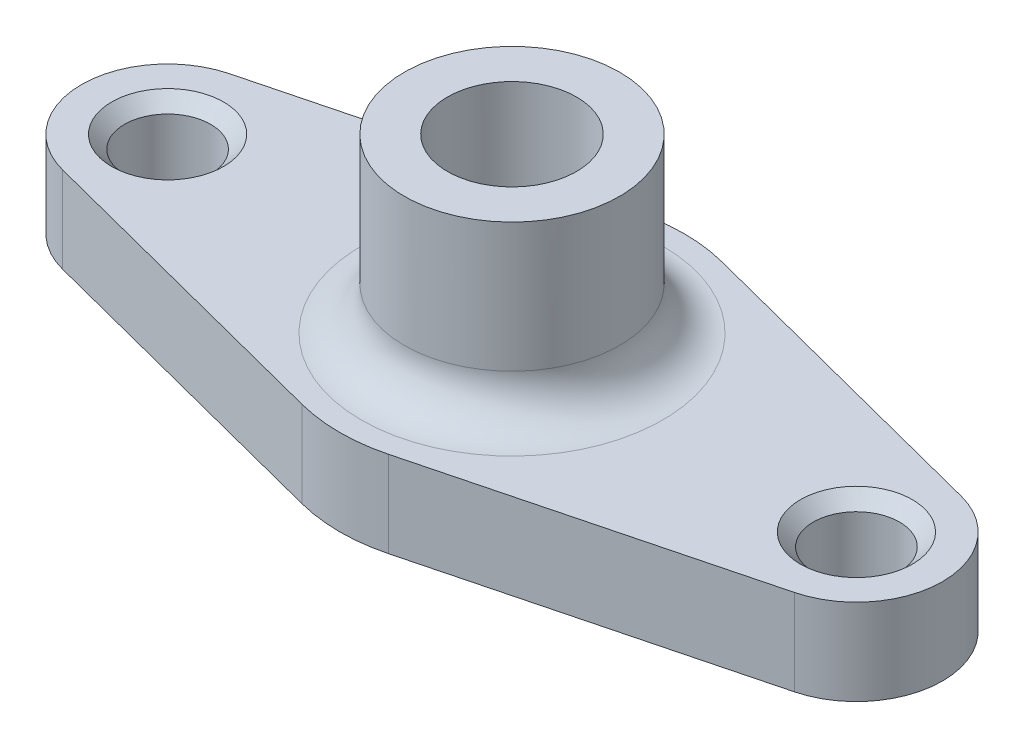
ISO-10303-21;
HEADER;
FILE_DESCRIPTION(('STEP AP214'),'2;1');
FILE_NAME('part.step','',(''),(''),'','','');
FILE_SCHEMA(('AUTOMOTIVE_DESIGN { 1 0 10303 214 1 1 1 1 }'));
ENDSEC;
DATA;
#1=APPLICATION_CONTEXT('core data for automotive mechanical design processes');
#2=APPLICATION_PROTOCOL_DEFINITION('international standard','automotive_design',2000,#1);
#3=PRODUCT_CONTEXT('',#1,'mechanical');
#4=PRODUCT('Part','Part','',(#3));
#5=PRODUCT_RELATED_PRODUCT_CATEGORY('part','',(#4));
#6=PRODUCT_DEFINITION_FORMATION('','',#4);
#7=PRODUCT_DEFINITION_CONTEXT('part definition',#1,'design');
#8=PRODUCT_DEFINITION('design','',#6,#7);
#9=PRODUCT_DEFINITION_SHAPE('','',#8);
#10=(LENGTH_UNIT() NAMED_UNIT(*) SI_UNIT(.MILLI.,.METRE.));
#11=(NAMED_UNIT(*) PLANE_ANGLE_UNIT() SI_UNIT($,.RADIAN.));
#12=(NAMED_UNIT(*) SI_UNIT($,.STERADIAN.) SOLID_ANGLE_UNIT());
#13=UNCERTAINTY_MEASURE_WITH_UNIT(LENGTH_MEASURE(1.E-05),#10,'distance_accuracy_value','');
#14=(GEOMETRIC_REPRESENTATION_CONTEXT(3) GLOBAL_UNCERTAINTY_ASSIGNED_CONTEXT((#13)) GLOBAL_UNIT_ASSIGNED_CONTEXT((#10,
#11,#12)) REPRESENTATION_CONTEXT('',''));
#15=CARTESIAN_POINT('',(0.,0.,0.));
#16=DIRECTION('',(0.,0.,1.));
#17=DIRECTION('',(1.,0.,0.));
#18=AXIS2_PLACEMENT_3D('',#15,#16,#17);
#19=CARTESIAN_POINT('',(-80.,20.,0.));
#20=DIRECTION('',(0.,-1.,0.));
#21=DIRECTION('',(0.,0.,-1.));
#22=AXIS2_PLACEMENT_3D('',#19,#20,#21);
#23=CYLINDRICAL_SURFACE('',#22,20.);
#24=CARTESIAN_POINT('',(-80.,0.,0.));
#25=DIRECTION('',(0.,1.,0.));
#26=DIRECTION('',(0.,0.,1.));
#27=AXIS2_PLACEMENT_3D('',#24,#25,#26);
#28=CIRCLE('',#27,20.);
#29=CARTESIAN_POINT('',(-85.,0.,19.3649167310371));
#30=VERTEX_POINT('',#29);
#31=CARTESIAN_POINT('',(-85.,0.,-19.3649167310371));
#32=VERTEX_POINT('',#31);
#33=EDGE_CURVE('E149',#30,#32,#28,.F.);
#34=ORIENTED_EDGE('',*,*,#33,.F.);
#35=DIRECTION('',(0.,-1.,0.));
#36=VECTOR('',#35,1.);
#37=CARTESIAN_POINT('',(-85.,20.,19.3649167310371));
#38=LINE('',#37,#36);
#39=CARTESIAN_POINT('',(-85.,20.,19.3649167310371));
#40=VERTEX_POINT('',#39);
#41=EDGE_CURVE('E104',#40,#30,#38,.T.);
#42=ORIENTED_EDGE('',*,*,#41,.F.);
#43=CARTESIAN_POINT('',(-80.,20.,0.));
#44=DIRECTION('',(0.,1.,0.));
#45=DIRECTION('',(0.,0.,1.));
#46=AXIS2_PLACEMENT_3D('',#43,#44,#45);
#47=CIRCLE('',#46,20.);
#48=CARTESIAN_POINT('',(-85.,20.,-19.3649167310371));
#49=VERTEX_POINT('',#48);
#50=EDGE_CURVE('E185',#40,#49,#47,.F.);
#51=ORIENTED_EDGE('',*,*,#50,.T.);
#52=DIRECTION('',(0.,-1.,0.));
#53=VECTOR('',#52,1.);
#54=CARTESIAN_POINT('',(-85.,20.,-19.3649167310371));
#55=LINE('',#54,#53);
#56=EDGE_CURVE('E99',#49,#32,#55,.T.);
#57=ORIENTED_EDGE('',*,*,#56,.T.);
#58=EDGE_LOOP('',(#34,#42,#51,#57));
#59=FACE_BOUND('',#58,.T.);
#60=ADVANCED_FACE('F45',(#59),#23,.T.);
#61=CARTESIAN_POINT('',(-10.,20.,38.7298334620742));
#62=DIRECTION('',(-0.25,0.,0.968245836551854));
#63=DIRECTION('',(0.968245836551854,0.,0.25));
#64=AXIS2_PLACEMENT_3D('',#61,#62,#63);
#65=PLANE('',#64);
#66=DIRECTION('',(-0.968245836551854,0.,-0.25));
#67=VECTOR('',#66,1.);
#68=CARTESIAN_POINT('',(-10.,0.,38.7298334620742));
#69=LINE('',#68,#67);
#70=CARTESIAN_POINT('',(-10.,0.,38.7298334620742));
#71=VERTEX_POINT('',#70);
#72=EDGE_CURVE('E153',#71,#30,#69,.T.);
#73=ORIENTED_EDGE('',*,*,#72,.F.);
#74=DIRECTION('',(0.,-1.,0.));
#75=VECTOR('',#74,1.);
#76=CARTESIAN_POINT('',(-10.,20.,38.7298334620742));
#77=LINE('',#76,#75);
#78=CARTESIAN_POINT('',(-10.,20.,38.7298334620742));
#79=VERTEX_POINT('',#78);
#80=EDGE_CURVE('E200',#79,#71,#77,.T.);
#81=ORIENTED_EDGE('',*,*,#80,.F.);
#82=DIRECTION('',(-0.968245836551854,0.,-0.25));
#83=VECTOR('',#82,1.);
#84=CARTESIAN_POINT('',(-10.,20.,38.7298334620742));
#85=LINE('',#84,#83);
#86=EDGE_CURVE('E294',#79,#40,#85,.T.);
#87=ORIENTED_EDGE('',*,*,#86,.T.);
#88=ORIENTED_EDGE('',*,*,#41,.T.);
#89=EDGE_LOOP('',(#73,#81,#87,#88));
#90=FACE_BOUND('',#89,.T.);
#91=ADVANCED_FACE('F236',(#90),#65,.T.);
#92=CARTESIAN_POINT('',(0.,20.,0.));
#93=DIRECTION('',(0.,-1.,0.));
#94=DIRECTION('',(0.,0.,-1.));
#95=AXIS2_PLACEMENT_3D('',#92,#93,#94);
#96=CYLINDRICAL_SURFACE('',#95,40.);
#97=CARTESIAN_POINT('',(0.,0.,0.));
#98=DIRECTION('',(0.,1.,0.));
#99=DIRECTION('',(0.,0.,1.));
#100=AXIS2_PLACEMENT_3D('',#97,#98,#99);
#101=CIRCLE('',#100,40.);
#102=CARTESIAN_POINT('',(10.,0.,38.7298334620742));
#103=VERTEX_POINT('',#102);
#104=EDGE_CURVE('E158',#71,#103,#101,.T.);
#105=ORIENTED_EDGE('',*,*,#104,.T.);
#106=DIRECTION('',(0.,-1.,0.));
#107=VECTOR('',#106,1.);
#108=CARTESIAN_POINT('',(10.,20.,38.7298334620742));
#109=LINE('',#108,#107);
#110=CARTESIAN_POINT('',(10.,20.,38.7298334620742));
#111=VERTEX_POINT('',#110);
#112=EDGE_CURVE('E196',#111,#103,#109,.T.);
#113=ORIENTED_EDGE('',*,*,#112,.F.);
#114=CARTESIAN_POINT('',(0.,20.,0.));
#115=DIRECTION('',(0.,1.,0.));
#116=DIRECTION('',(0.,0.,1.));
#117=AXIS2_PLACEMENT_3D('',#114,#115,#116);
#118=CIRCLE('',#117,40.);
#119=EDGE_CURVE('E135',#79,#111,#118,.T.);
#120=ORIENTED_EDGE('',*,*,#119,.F.);
#121=ORIENTED_EDGE('',*,*,#80,.T.);
#122=EDGE_LOOP('',(#105,#113,#120,#121));
#123=FACE_BOUND('',#122,.T.);
#124=ADVANCED_FACE('F241',(#123),#96,.T.);
#125=CARTESIAN_POINT('',(10.,20.,38.7298334620742));
#126=DIRECTION('',(-0.25,0.,-0.968245836551854));
#127=DIRECTION('',(-0.968245836551854,0.,0.25));
#128=AXIS2_PLACEMENT_3D('',#125,#126,#127);
#129=PLANE('',#128);
#130=DIRECTION('',(0.968245836551854,0.,-0.25));
#131=VECTOR('',#130,1.);
#132=CARTESIAN_POINT('',(10.,0.,38.7298334620742));
#133=LINE('',#132,#131);
#134=CARTESIAN_POINT('',(85.,0.,19.3649167310371));
#135=VERTEX_POINT('',#134);
#136=EDGE_CURVE('E161',#103,#135,#133,.T.);
#137=ORIENTED_EDGE('',*,*,#136,.T.);
#138=DIRECTION('',(0.,-1.,0.));
#139=VECTOR('',#138,1.);
#140=CARTESIAN_POINT('',(85.,20.,19.3649167310371));
#141=LINE('',#140,#139);
#142=CARTESIAN_POINT('',(85.,20.,19.3649167310371));
#143=VERTEX_POINT('',#142);
#144=EDGE_CURVE('E192',#143,#135,#141,.T.);
#145=ORIENTED_EDGE('',*,*,#144,.F.);
#146=DIRECTION('',(0.968245836551854,0.,-0.25));
#147=VECTOR('',#146,1.);
#148=CARTESIAN_POINT('',(10.,20.,38.7298334620742));
#149=LINE('',#148,#147);
#150=EDGE_CURVE('E143',#111,#143,#149,.T.);
#151=ORIENTED_EDGE('',*,*,#150,.F.);
#152=ORIENTED_EDGE('',*,*,#112,.T.);
#153=EDGE_LOOP('',(#137,#145,#151,#152));
#154=FACE_BOUND('',#153,.T.);
#155=ADVANCED_FACE('F305',(#154),#129,.F.);
#156=CARTESIAN_POINT('',(80.,20.,0.));
#157=DIRECTION('',(0.,-1.,0.));
#158=DIRECTION('',(0.,0.,-1.));
#159=AXIS2_PLACEMENT_3D('',#156,#157,#158);
#160=CYLINDRICAL_SURFACE('',#159,20.);
#161=CARTESIAN_POINT('',(80.,0.,0.));
#162=DIRECTION('',(0.,1.,0.));
#163=DIRECTION('',(0.,0.,1.));
#164=AXIS2_PLACEMENT_3D('',#161,#162,#163);
#165=CIRCLE('',#164,20.);
#166=CARTESIAN_POINT('',(85.,0.,-19.3649167310371));
#167=VERTEX_POINT('',#166);
#168=EDGE_CURVE('E164',#135,#167,#165,.T.);
#169=ORIENTED_EDGE('',*,*,#168,.T.);
#170=DIRECTION('',(0.,-1.,0.));
#171=VECTOR('',#170,1.);
#172=CARTESIAN_POINT('',(85.,20.,-19.3649167310371));
#173=LINE('',#172,#171);
#174=CARTESIAN_POINT('',(85.,20.,-19.3649167310371));
#175=VERTEX_POINT('',#174);
#176=EDGE_CURVE('E128',#175,#167,#173,.T.);
#177=ORIENTED_EDGE('',*,*,#176,.F.);
#178=CARTESIAN_POINT('',(80.,20.,0.));
#179=DIRECTION('',(0.,1.,0.));
#180=DIRECTION('',(0.,0.,1.));
#181=AXIS2_PLACEMENT_3D('',#178,#179,#180);
#182=CIRCLE('',#181,20.);
#183=EDGE_CURVE('E138',#143,#175,#182,.T.);
#184=ORIENTED_EDGE('',*,*,#183,.F.);
#185=ORIENTED_EDGE('',*,*,#144,.T.);
#186=EDGE_LOOP('',(#169,#177,#184,#185));
#187=FACE_BOUND('',#186,.T.);
#188=ADVANCED_FACE('F309',(#187),#160,.T.);
#189=CARTESIAN_POINT('',(10.,20.,-38.7298334620742));
#190=DIRECTION('',(0.25,0.,-0.968245836551854));
#191=DIRECTION('',(-0.968245836551854,0.,-0.25));
#192=AXIS2_PLACEMENT_3D('',#189,#190,#191);
#193=PLANE('',#192);
#194=DIRECTION('',(0.968245836551854,0.,0.25));
#195=VECTOR('',#194,1.);
#196=CARTESIAN_POINT('',(10.,0.,-38.7298334620742));
#197=LINE('',#196,#195);
#198=CARTESIAN_POINT('',(10.,0.,-38.7298334620742));
#199=VERTEX_POINT('',#198);
#200=EDGE_CURVE('E126',#199,#167,#197,.T.);
#201=ORIENTED_EDGE('',*,*,#200,.F.);
#202=DIRECTION('',(0.,-1.,0.));
#203=VECTOR('',#202,1.);
#204=CARTESIAN_POINT('',(10.,20.,-38.7298334620742));
#205=LINE('',#204,#203);
#206=CARTESIAN_POINT('',(10.,20.,-38.7298334620742));
#207=VERTEX_POINT('',#206);
#208=EDGE_CURVE('E120',#207,#199,#205,.T.);
#209=ORIENTED_EDGE('',*,*,#208,.F.);
#210=DIRECTION('',(0.968245836551854,0.,0.25));
#211=VECTOR('',#210,1.);
#212=CARTESIAN_POINT('',(10.,20.,-38.7298334620742));
#213=LINE('',#212,#211);
#214=EDGE_CURVE('E124',#207,#175,#213,.T.);
#215=ORIENTED_EDGE('',*,*,#214,.T.);
#216=ORIENTED_EDGE('',*,*,#176,.T.);
#217=EDGE_LOOP('',(#201,#209,#215,#216));
#218=FACE_BOUND('',#217,.T.);
#219=ADVANCED_FACE('F122',(#218),#193,.T.);
#220=CARTESIAN_POINT('',(-10.,0.,-38.7298334620742));
#221=VERTEX_POINT('',#220);
#222=EDGE_CURVE('E92',#199,#221,#101,.T.);
#223=ORIENTED_EDGE('',*,*,#222,.T.);
#224=DIRECTION('',(0.,-1.,0.));
#225=VECTOR('',#224,1.);
#226=CARTESIAN_POINT('',(-10.,20.,-38.7298334620742));
#227=LINE('',#226,#225);
#228=CARTESIAN_POINT('',(-10.,20.,-38.7298334620742));
#229=VERTEX_POINT('',#228);
#230=EDGE_CURVE('E129',#229,#221,#227,.T.);
#231=ORIENTED_EDGE('',*,*,#230,.F.);
#232=EDGE_CURVE('E131',#207,#229,#118,.T.);
#233=ORIENTED_EDGE('',*,*,#232,.F.);
#234=ORIENTED_EDGE('',*,*,#208,.T.);
#235=EDGE_LOOP('',(#223,#231,#233,#234));
#236=FACE_BOUND('',#235,.T.);
#237=ADVANCED_FACE('F132',(#236),#96,.T.);
#238=CARTESIAN_POINT('',(80.,20.,0.));
#239=DIRECTION('',(0.,-1.,0.));
#240=DIRECTION('',(0.,0.,-1.));
#241=AXIS2_PLACEMENT_3D('',#238,#239,#240);
#242=CYLINDRICAL_SURFACE('',#241,9.99999999999999);
#243=CARTESIAN_POINT('',(80.,17.,0.));
#244=DIRECTION('',(0.,1.,0.));
#245=DIRECTION('',(0.,0.,1.));
#246=AXIS2_PLACEMENT_3D('',#243,#244,#245);
#247=CIRCLE('',#246,9.99999999999999);
#248=CARTESIAN_POINT('',(80.,17.,9.99999999999999));
#249=VERTEX_POINT('',#248);
#250=EDGE_CURVE('E11',#249,#249,#247,.T.);
#251=ORIENTED_EDGE('',*,*,#250,.T.);
#252=EDGE_LOOP('',(#251));
#253=FACE_BOUND('',#252,.T.);
#254=CARTESIAN_POINT('',(80.,0.,0.));
#255=DIRECTION('',(0.,1.,0.));
#256=DIRECTION('',(0.,0.,1.));
#257=AXIS2_PLACEMENT_3D('',#254,#255,#256);
#258=CIRCLE('',#257,9.99999999999999);
#259=CARTESIAN_POINT('',(80.,0.,9.99999999999999));
#260=VERTEX_POINT('',#259);
#261=EDGE_CURVE('E177',#260,#260,#258,.F.);
#262=ORIENTED_EDGE('',*,*,#261,.T.);
#263=EDGE_LOOP('',(#262));
#264=FACE_BOUND('',#263,.T.);
#265=ADVANCED_FACE('F266',(#253,#264),#242,.F.);
#266=CARTESIAN_POINT('',(-80.,20.,0.));
#267=DIRECTION('',(0.,-1.,0.));
#268=DIRECTION('',(0.,0.,-1.));
#269=AXIS2_PLACEMENT_3D('',#266,#267,#268);
#270=CYLINDRICAL_SURFACE('',#269,9.99999999999999);
#271=CARTESIAN_POINT('',(-80.,17.,0.));
#272=DIRECTION('',(0.,1.,0.));
#273=DIRECTION('',(0.,0.,1.));
#274=AXIS2_PLACEMENT_3D('',#271,#272,#273);
#275=CIRCLE('',#274,9.99999999999999);
#276=CARTESIAN_POINT('',(-80.,17.,9.99999999999999));
#277=VERTEX_POINT('',#276);
#278=EDGE_CURVE('E205',#277,#277,#275,.T.);
#279=ORIENTED_EDGE('',*,*,#278,.T.);
#280=EDGE_LOOP('',(#279));
#281=FACE_BOUND('',#280,.T.);
#282=CARTESIAN_POINT('',(-80.,0.,0.));
#283=DIRECTION('',(0.,1.,0.));
#284=DIRECTION('',(0.,0.,1.));
#285=AXIS2_PLACEMENT_3D('',#282,#283,#284);
#286=CIRCLE('',#285,9.99999999999999);
#287=CARTESIAN_POINT('',(-80.,0.,9.99999999999999));
#288=VERTEX_POINT('',#287);
#289=EDGE_CURVE('E173',#288,#288,#286,.T.);
#290=ORIENTED_EDGE('',*,*,#289,.F.);
#291=EDGE_LOOP('',(#290));
#292=FACE_BOUND('',#291,.T.);
#293=ADVANCED_FACE('F262',(#281,#292),#270,.F.);
#294=CARTESIAN_POINT('',(-10.,20.,-38.7298334620742));
#295=DIRECTION('',(0.25,0.,0.968245836551854));
#296=DIRECTION('',(0.968245836551854,0.,-0.25));
#297=AXIS2_PLACEMENT_3D('',#294,#295,#296);
#298=PLANE('',#297);
#299=DIRECTION('',(-0.968245836551854,0.,0.25));
#300=VECTOR('',#299,1.);
#301=CARTESIAN_POINT('',(-10.,0.,-38.7298334620742));
#302=LINE('',#301,#300);
#303=EDGE_CURVE('E170',#221,#32,#302,.T.);
#304=ORIENTED_EDGE('',*,*,#303,.T.);
#305=ORIENTED_EDGE('',*,*,#56,.F.);
#306=DIRECTION('',(-0.968245836551854,0.,0.25));
#307=VECTOR('',#306,1.);
#308=CARTESIAN_POINT('',(-10.,20.,-38.7298334620742));
#309=LINE('',#308,#307);
#310=EDGE_CURVE('E64',#229,#49,#309,.T.);
#311=ORIENTED_EDGE('',*,*,#310,.F.);
#312=ORIENTED_EDGE('',*,*,#230,.T.);
#313=EDGE_LOOP('',(#304,#305,#311,#312));
#314=FACE_BOUND('',#313,.T.);
#315=ADVANCED_FACE('F265',(#314),#298,.F.);
#316=CARTESIAN_POINT('',(0.,20.,0.));
#317=DIRECTION('',(0.,-1.,0.));
#318=DIRECTION('',(0.,0.,-1.));
#319=AXIS2_PLACEMENT_3D('',#316,#317,#318);
#320=CYLINDRICAL_SURFACE('',#319,15.);
#321=CARTESIAN_POINT('',(0.,0.,0.));
#322=DIRECTION('',(0.,1.,0.));
#323=DIRECTION('',(0.,0.,1.));
#324=AXIS2_PLACEMENT_3D('',#321,#322,#323);
#325=CIRCLE('',#324,15.);
#326=CARTESIAN_POINT('',(0.,0.,15.));
#327=VERTEX_POINT('',#326);
#328=EDGE_CURVE('E181',#327,#327,#325,.T.);
#329=ORIENTED_EDGE('',*,*,#328,.F.);
#330=EDGE_LOOP('',(#329));
#331=FACE_BOUND('',#330,.T.);
#332=CARTESIAN_POINT('',(0.,60.,0.));
#333=DIRECTION('',(0.,-1.,0.));
#334=DIRECTION('',(0.,0.,-1.));
#335=AXIS2_PLACEMENT_3D('',#332,#333,#334);
#336=CIRCLE('',#335,15.);
#337=CARTESIAN_POINT('',(0.,60.,-15.));
#338=VERTEX_POINT('',#337);
#339=EDGE_CURVE('E285',#338,#338,#336,.T.);
#340=ORIENTED_EDGE('',*,*,#339,.F.);
#341=EDGE_LOOP('',(#340));
#342=FACE_BOUND('',#341,.T.);
#343=ADVANCED_FACE('F279',(#331,#342),#320,.F.);
#344=CARTESIAN_POINT('',(0.,20.,0.));
#345=DIRECTION('',(0.,1.,0.));
#346=DIRECTION('',(0.,0.,1.));
#347=AXIS2_PLACEMENT_3D('',#344,#345,#346);
#348=PLANE('',#347);
#349=CARTESIAN_POINT('',(80.,20.,0.));
#350=DIRECTION('',(0.,1.,0.));
#351=DIRECTION('',(0.,0.,1.));
#352=AXIS2_PLACEMENT_3D('',#349,#350,#351);
#353=CIRCLE('',#352,13.);
#354=CARTESIAN_POINT('',(80.,20.,13.));
#355=VERTEX_POINT('',#354);
#356=EDGE_CURVE('E56',#355,#355,#353,.F.);
#357=ORIENTED_EDGE('',*,*,#356,.T.);
#358=EDGE_LOOP('',(#357));
#359=FACE_BOUND('',#358,.T.);
#360=CARTESIAN_POINT('',(0.,20.,0.));
#361=DIRECTION('',(0.,1.,0.));
#362=DIRECTION('',(0.,0.,1.));
#363=AXIS2_PLACEMENT_3D('',#360,#361,#362);
#364=CIRCLE('',#363,35.);
#365=CARTESIAN_POINT('',(0.,20.,35.));
#366=VERTEX_POINT('',#365);
#367=EDGE_CURVE('E217',#366,#366,#364,.F.);
#368=ORIENTED_EDGE('',*,*,#367,.T.);
#369=EDGE_LOOP('',(#368));
#370=FACE_BOUND('',#369,.T.);
#371=CARTESIAN_POINT('',(-80.,20.,0.));
#372=DIRECTION('',(0.,1.,0.));
#373=DIRECTION('',(0.,0.,1.));
#374=AXIS2_PLACEMENT_3D('',#371,#372,#373);
#375=CIRCLE('',#374,13.);
#376=CARTESIAN_POINT('',(-80.,20.,13.));
#377=VERTEX_POINT('',#376);
#378=EDGE_CURVE('E209',#377,#377,#375,.F.);
#379=ORIENTED_EDGE('',*,*,#378,.T.);
#380=EDGE_LOOP('',(#379));
#381=FACE_BOUND('',#380,.T.);
#382=ORIENTED_EDGE('',*,*,#50,.F.);
#383=ORIENTED_EDGE('',*,*,#86,.F.);
#384=ORIENTED_EDGE('',*,*,#119,.T.);
#385=ORIENTED_EDGE('',*,*,#150,.T.);
#386=ORIENTED_EDGE('',*,*,#183,.T.);
#387=ORIENTED_EDGE('',*,*,#214,.F.);
#388=ORIENTED_EDGE('',*,*,#232,.T.);
#389=ORIENTED_EDGE('',*,*,#310,.T.);
#390=EDGE_LOOP('',(#382,#383,#384,#385,#386,#387,#388,#389));
#391=FACE_BOUND('',#390,.T.);
#392=ADVANCED_FACE('F136',(#359,#370,#381,#391),#348,.T.);
#393=CARTESIAN_POINT('',(0.,0.,0.));
#394=DIRECTION('',(0.,1.,0.));
#395=DIRECTION('',(0.,0.,1.));
#396=AXIS2_PLACEMENT_3D('',#393,#394,#395);
#397=PLANE('',#396);
#398=ORIENTED_EDGE('',*,*,#33,.T.);
#399=ORIENTED_EDGE('',*,*,#303,.F.);
#400=ORIENTED_EDGE('',*,*,#222,.F.);
#401=ORIENTED_EDGE('',*,*,#200,.T.);
#402=ORIENTED_EDGE('',*,*,#168,.F.);
#403=ORIENTED_EDGE('',*,*,#136,.F.);
#404=ORIENTED_EDGE('',*,*,#104,.F.);
#405=ORIENTED_EDGE('',*,*,#72,.T.);
#406=EDGE_LOOP('',(#398,#399,#400,#401,#402,#403,#404,#405));
#407=FACE_BOUND('',#406,.T.);
#408=ORIENTED_EDGE('',*,*,#289,.T.);
#409=EDGE_LOOP('',(#408));
#410=FACE_BOUND('',#409,.T.);
#411=ORIENTED_EDGE('',*,*,#261,.F.);
#412=EDGE_LOOP('',(#411));
#413=FACE_BOUND('',#412,.T.);
#414=ORIENTED_EDGE('',*,*,#328,.T.);
#415=EDGE_LOOP('',(#414));
#416=FACE_BOUND('',#415,.T.);
#417=ADVANCED_FACE('F270',(#407,#410,#413,#416),#397,.F.);
#418=CARTESIAN_POINT('',(0.,60.,0.));
#419=DIRECTION('',(0.,-1.,0.));
#420=DIRECTION('',(0.,0.,-1.));
#421=AXIS2_PLACEMENT_3D('',#418,#419,#420);
#422=CYLINDRICAL_SURFACE('',#421,25.);
#423=CARTESIAN_POINT('',(0.,30.,0.));
#424=DIRECTION('',(0.,1.,0.));
#425=DIRECTION('',(0.,0.,1.));
#426=AXIS2_PLACEMENT_3D('',#423,#424,#425);
#427=CIRCLE('',#426,25.);
#428=CARTESIAN_POINT('',(0.,30.,25.));
#429=VERTEX_POINT('',#428);
#430=EDGE_CURVE('E213',#429,#429,#427,.T.);
#431=ORIENTED_EDGE('',*,*,#430,.T.);
#432=EDGE_LOOP('',(#431));
#433=FACE_BOUND('',#432,.T.);
#434=CARTESIAN_POINT('',(0.,60.,0.));
#435=DIRECTION('',(0.,-1.,0.));
#436=DIRECTION('',(0.,0.,-1.));
#437=AXIS2_PLACEMENT_3D('',#434,#435,#436);
#438=CIRCLE('',#437,25.);
#439=CARTESIAN_POINT('',(0.,60.,-25.));
#440=VERTEX_POINT('',#439);
#441=EDGE_CURVE('E154',#440,#440,#438,.T.);
#442=ORIENTED_EDGE('',*,*,#441,.T.);
#443=EDGE_LOOP('',(#442));
#444=FACE_BOUND('',#443,.T.);
#445=ADVANCED_FACE('F255',(#433,#444),#422,.T.);
#446=CARTESIAN_POINT('',(0.,60.,0.));
#447=DIRECTION('',(0.,-1.,0.));
#448=DIRECTION('',(0.,0.,-1.));
#449=AXIS2_PLACEMENT_3D('',#446,#447,#448);
#450=PLANE('',#449);
#451=ORIENTED_EDGE('',*,*,#339,.T.);
#452=EDGE_LOOP('',(#451));
#453=FACE_BOUND('',#452,.T.);
#454=ORIENTED_EDGE('',*,*,#441,.F.);
#455=EDGE_LOOP('',(#454));
#456=FACE_BOUND('',#455,.T.);
#457=ADVANCED_FACE('F250',(#453,#456),#450,.F.);
#458=CARTESIAN_POINT('',(-80.,17.,0.));
#459=DIRECTION('',(0.,1.,0.));
#460=DIRECTION('',(0.,0.,1.));
#461=AXIS2_PLACEMENT_3D('',#458,#459,#460);
#462=CONICAL_SURFACE('',#461,9.99999999999999,0.785398163397447);
#463=CARTESIAN_POINT('',(-80.,20.,13.));
#464=CARTESIAN_POINT('',(-80.,19.96875,12.96875));
#465=CARTESIAN_POINT('',(-80.,19.9375,12.9375));
#466=CARTESIAN_POINT('',(-80.,19.875,12.875));
#467=CARTESIAN_POINT('',(-80.,19.84375,12.84375));
#468=CARTESIAN_POINT('',(-80.,19.78125,12.78125));
#469=CARTESIAN_POINT('',(-80.,19.75,12.75));
#470=CARTESIAN_POINT('',(-80.,19.6875,12.6875));
#471=CARTESIAN_POINT('',(-80.,19.65625,12.65625));
#472=CARTESIAN_POINT('',(-80.,19.59375,12.59375));
#473=CARTESIAN_POINT('',(-80.,19.5625,12.5625));
#474=CARTESIAN_POINT('',(-80.,19.5,12.5));
#475=CARTESIAN_POINT('',(-80.,19.46875,12.46875));
#476=CARTESIAN_POINT('',(-80.,19.40625,12.40625));
#477=CARTESIAN_POINT('',(-80.,19.375,12.375));
#478=CARTESIAN_POINT('',(-80.,19.3125,12.3125));
#479=CARTESIAN_POINT('',(-80.,19.28125,12.28125));
#480=CARTESIAN_POINT('',(-80.,19.21875,12.21875));
#481=CARTESIAN_POINT('',(-80.,19.1875,12.1875));
#482=CARTESIAN_POINT('',(-80.,19.125,12.125));
#483=CARTESIAN_POINT('',(-80.,19.09375,12.09375));
#484=CARTESIAN_POINT('',(-80.,19.03125,12.03125));
#485=CARTESIAN_POINT('',(-80.,19.,12.));
#486=CARTESIAN_POINT('',(-80.,18.9375,11.9375));
#487=CARTESIAN_POINT('',(-80.,18.90625,11.90625));
#488=CARTESIAN_POINT('',(-80.,18.84375,11.84375));
#489=CARTESIAN_POINT('',(-80.,18.8125,11.8125));
#490=CARTESIAN_POINT('',(-80.,18.75,11.75));
#491=CARTESIAN_POINT('',(-80.,18.71875,11.71875));
#492=CARTESIAN_POINT('',(-80.,18.65625,11.65625));
#493=CARTESIAN_POINT('',(-80.,18.625,11.625));
#494=CARTESIAN_POINT('',(-80.,18.5625,11.5625));
#495=CARTESIAN_POINT('',(-80.,18.53125,11.53125));
#496=CARTESIAN_POINT('',(-80.,18.46875,11.46875));
#497=CARTESIAN_POINT('',(-80.,18.4375,11.4375));
#498=CARTESIAN_POINT('',(-80.,18.375,11.375));
#499=CARTESIAN_POINT('',(-80.,18.34375,11.34375));
#500=CARTESIAN_POINT('',(-80.,18.28125,11.28125));
#501=CARTESIAN_POINT('',(-80.,18.25,11.25));
#502=CARTESIAN_POINT('',(-80.,18.1875,11.1875));
#503=CARTESIAN_POINT('',(-80.,18.15625,11.15625));
#504=CARTESIAN_POINT('',(-80.,18.09375,11.09375));
#505=CARTESIAN_POINT('',(-80.,18.0625,11.0625));
#506=CARTESIAN_POINT('',(-80.,18.,11.));
#507=CARTESIAN_POINT('',(-80.,17.96875,10.96875));
#508=CARTESIAN_POINT('',(-80.,17.90625,10.90625));
#509=CARTESIAN_POINT('',(-80.,17.875,10.875));
#510=CARTESIAN_POINT('',(-80.,17.8125,10.8125));
#511=CARTESIAN_POINT('',(-80.,17.78125,10.78125));
#512=CARTESIAN_POINT('',(-80.,17.71875,10.71875));
#513=CARTESIAN_POINT('',(-80.,17.6875,10.6875));
#514=CARTESIAN_POINT('',(-80.,17.625,10.625));
#515=CARTESIAN_POINT('',(-80.,17.59375,10.59375));
#516=CARTESIAN_POINT('',(-80.,17.53125,10.53125));
#517=CARTESIAN_POINT('',(-80.,17.5,10.5));
#518=CARTESIAN_POINT('',(-80.,17.4375,10.4375));
#519=CARTESIAN_POINT('',(-80.,17.40625,10.40625));
#520=CARTESIAN_POINT('',(-80.,17.34375,10.34375));
#521=CARTESIAN_POINT('',(-80.,17.3125,10.3125));
#522=CARTESIAN_POINT('',(-80.,17.25,10.25));
#523=CARTESIAN_POINT('',(-80.,17.21875,10.21875));
#524=CARTESIAN_POINT('',(-80.,17.15625,10.15625));
#525=CARTESIAN_POINT('',(-80.,17.125,10.125));
#526=CARTESIAN_POINT('',(-80.,17.0625,10.0625));
#527=CARTESIAN_POINT('',(-80.,17.03125,10.03125));
#528=CARTESIAN_POINT('',(-80.,17.,9.99999999999999));
#529=B_SPLINE_CURVE_WITH_KNOTS('',3,(#463,#464,#465,#466,#467,#468,#469,#470,#471,#472,#473,
#474,#475,#476,#477,#478,#479,#480,#481,#482,#483,#484,#485,#486,#487,#488,#489,#490,#491,#492,
#493,#494,#495,#496,#497,#498,#499,#500,#501,#502,#503,#504,#505,#506,#507,#508,#509,#510,#511,
#512,#513,#514,#515,#516,#517,#518,#519,#520,#521,#522,#523,#524,#525,#526,#527,#528),
.UNSPECIFIED.,.F.,.F.,(4,2,2,2,2,2,2,2,2,2,2,2,2,2,2,2,2,2,2,2,2,2,2,2,2,2,2,2,2,2,2,2,4),(0.,
0.132582521472481,0.265165042944959,0.397747564417438,0.530330085889916,0.662912607362394,
0.795495128834874,0.928077650307352,1.06066017177983,1.19324269325231,1.32582521472479,
1.45840773619727,1.59099025766975,1.72357277914222,1.8561553006147,1.98873782208718,
2.12132034355966,2.25390286503214,2.38648538650462,2.5190679079771,2.65165042944957,
2.78423295092205,2.91681547239453,3.04939799386701,3.18198051533949,3.31456303681196,
3.44714555828444,3.57972807975692,3.7123106012294,3.84489312270188,3.97747564417436,
4.11005816564684,4.24264068711931),.UNSPECIFIED.);
#530=EDGE_CURVE('BSEAM232',#377,#277,#529,.T.);
#531=ORIENTED_EDGE('',*,*,#378,.F.);
#532=ORIENTED_EDGE('',*,*,#278,.F.);
#533=ORIENTED_EDGE('',*,*,#530,.T.);
#534=ORIENTED_EDGE('',*,*,#530,.F.);
#535=EDGE_LOOP('',(#531,#533,#532,#534));
#536=FACE_BOUND('',#535,.T.);
#537=ADVANCED_FACE('F232',(#536),#462,.F.);
#538=CARTESIAN_POINT('',(0.,30.,0.));
#539=DIRECTION('',(0.,1.,0.));
#540=DIRECTION('',(0.,0.,1.));
#541=AXIS2_PLACEMENT_3D('',#538,#539,#540);
#542=TOROIDAL_SURFACE('',#541,35.,10.);
#543=ORIENTED_EDGE('',*,*,#367,.F.);
#544=EDGE_LOOP('',(#543));
#545=FACE_BOUND('',#544,.T.);
#546=ORIENTED_EDGE('',*,*,#430,.F.);
#547=EDGE_LOOP('',(#546));
#548=FACE_BOUND('',#547,.T.);
#549=ADVANCED_FACE('F227',(#545,#548),#542,.F.);
#550=CARTESIAN_POINT('',(80.,20.,0.));
#551=DIRECTION('',(0.,1.,0.));
#552=DIRECTION('',(0.,0.,1.));
#553=AXIS2_PLACEMENT_3D('',#550,#551,#552);
#554=CONICAL_SURFACE('',#553,13.,0.785398163397445);
#555=ORIENTED_EDGE('',*,*,#250,.F.);
#556=EDGE_LOOP('',(#555));
#557=FACE_BOUND('',#556,.T.);
#558=ORIENTED_EDGE('',*,*,#356,.F.);
#559=EDGE_LOOP('',(#558));
#560=FACE_BOUND('',#559,.T.);
#561=ADVANCED_FACE('F48',(#557,#560),#554,.F.);
#562=CLOSED_SHELL('',(#60,#91,#124,#155,#188,#219,#237,#265,#293,#315,#343,#392,#417,#445,#457,
#537,#549,#561));
#563=MANIFOLD_SOLID_BREP('B2',#562);
#564=ADVANCED_BREP_SHAPE_REPRESENTATION('',(#18,#563),#14);
#565=SHAPE_DEFINITION_REPRESENTATION(#9,#564);
ENDSEC;
END-ISO-10303-21;
